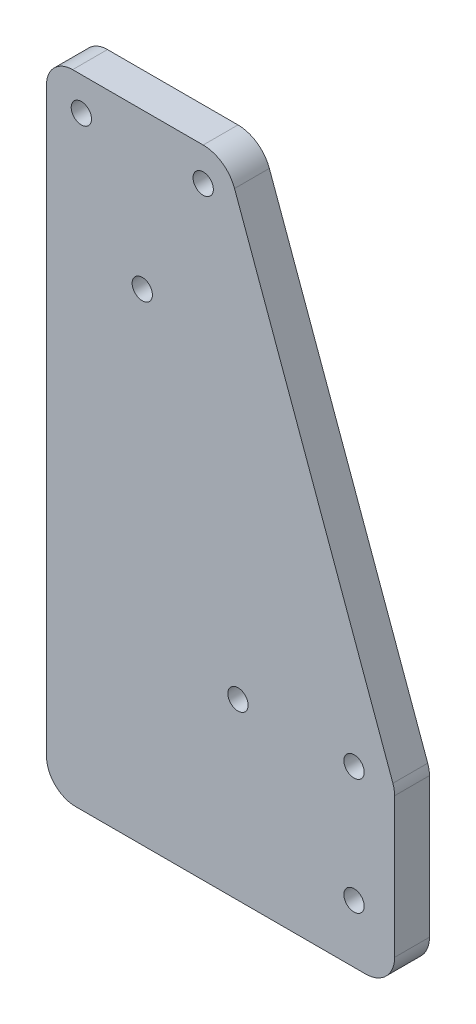
ISO-10303-21;
HEADER;
FILE_DESCRIPTION(('STEP AP214'),'2;1');
FILE_NAME('part.step','',(''),(''),'','','');
FILE_SCHEMA(('AUTOMOTIVE_DESIGN { 1 0 10303 214 1 1 1 1 }'));
ENDSEC;
DATA;
#1=APPLICATION_CONTEXT('core data for automotive mechanical design processes');
#2=APPLICATION_PROTOCOL_DEFINITION('international standard','automotive_design',2000,#1);
#3=PRODUCT_CONTEXT('',#1,'mechanical');
#4=PRODUCT('Part','Part','',(#3));
#5=PRODUCT_RELATED_PRODUCT_CATEGORY('part','',(#4));
#6=PRODUCT_DEFINITION_FORMATION('','',#4);
#7=PRODUCT_DEFINITION_CONTEXT('part definition',#1,'design');
#8=PRODUCT_DEFINITION('design','',#6,#7);
#9=PRODUCT_DEFINITION_SHAPE('','',#8);
#10=(LENGTH_UNIT() NAMED_UNIT(*) SI_UNIT(.MILLI.,.METRE.));
#11=(NAMED_UNIT(*) PLANE_ANGLE_UNIT() SI_UNIT($,.RADIAN.));
#12=(NAMED_UNIT(*) SI_UNIT($,.STERADIAN.) SOLID_ANGLE_UNIT());
#13=UNCERTAINTY_MEASURE_WITH_UNIT(LENGTH_MEASURE(1.E-05),#10,'distance_accuracy_value','');
#14=(GEOMETRIC_REPRESENTATION_CONTEXT(3) GLOBAL_UNCERTAINTY_ASSIGNED_CONTEXT((#13)) GLOBAL_UNIT_ASSIGNED_CONTEXT((#10,
#11,#12)) REPRESENTATION_CONTEXT('',''));
#15=CARTESIAN_POINT('',(0.,0.,0.));
#16=DIRECTION('',(0.,0.,1.));
#17=DIRECTION('',(1.,0.,0.));
#18=AXIS2_PLACEMENT_3D('',#15,#16,#17);
#19=CARTESIAN_POINT('',(-30.,-55.,6.));
#20=DIRECTION('',(1.,0.,0.));
#21=DIRECTION('',(0.,0.,-1.));
#22=AXIS2_PLACEMENT_3D('',#19,#20,#21);
#23=PLANE('',#22);
#24=DIRECTION('',(0.,-1.,0.));
#25=VECTOR('',#24,1.);
#26=CARTESIAN_POINT('',(-30.,-55.,0.));
#27=LINE('',#26,#25);
#28=CARTESIAN_POINT('',(-30.,50.25,0.));
#29=VERTEX_POINT('',#28);
#30=CARTESIAN_POINT('',(-30.,-50.,0.));
#31=VERTEX_POINT('',#30);
#32=EDGE_CURVE('E200',#29,#31,#27,.T.);
#33=ORIENTED_EDGE('',*,*,#32,.T.);
#34=DIRECTION('',(0.,0.,-1.));
#35=VECTOR('',#34,1.);
#36=CARTESIAN_POINT('',(-30.,-50.,6.));
#37=LINE('',#36,#35);
#38=CARTESIAN_POINT('',(-30.,-50.,6.));
#39=VERTEX_POINT('',#38);
#40=EDGE_CURVE('E11',#31,#39,#37,.F.);
#41=ORIENTED_EDGE('',*,*,#40,.T.);
#42=DIRECTION('',(0.,-1.,0.));
#43=VECTOR('',#42,1.);
#44=CARTESIAN_POINT('',(-30.,-55.,6.));
#45=LINE('',#44,#43);
#46=CARTESIAN_POINT('',(-30.,50.25,6.));
#47=VERTEX_POINT('',#46);
#48=EDGE_CURVE('E192',#47,#39,#45,.T.);
#49=ORIENTED_EDGE('',*,*,#48,.F.);
#50=DIRECTION('',(0.,0.,-1.));
#51=VECTOR('',#50,1.);
#52=CARTESIAN_POINT('',(-30.,50.25,6.));
#53=LINE('',#52,#51);
#54=EDGE_CURVE('E150',#47,#29,#53,.T.);
#55=ORIENTED_EDGE('',*,*,#54,.T.);
#56=EDGE_LOOP('',(#33,#41,#49,#55));
#57=FACE_BOUND('',#56,.T.);
#58=ADVANCED_FACE('F33',(#57),#23,.F.);
#59=CARTESIAN_POINT('',(0.,0.,6.));
#60=DIRECTION('',(0.,0.,-1.));
#61=DIRECTION('',(-1.,0.,0.));
#62=AXIS2_PLACEMENT_3D('',#59,#60,#61);
#63=PLANE('',#62);
#64=DIRECTION('',(0.,1.,0.));
#65=VECTOR('',#64,1.);
#66=CARTESIAN_POINT('',(30.,-55.,6.));
#67=LINE('',#66,#65);
#68=CARTESIAN_POINT('',(30.,-50.,6.));
#69=VERTEX_POINT('',#68);
#70=CARTESIAN_POINT('',(30.,-25.8800519672053,6.));
#71=VERTEX_POINT('',#70);
#72=EDGE_CURVE('E190',#69,#71,#67,.T.);
#73=ORIENTED_EDGE('',*,*,#72,.T.);
#74=CARTESIAN_POINT('',(25.,-25.8800519672053,6.));
#75=DIRECTION('',(0.,0.,-1.));
#76=DIRECTION('',(-1.,0.,0.));
#77=AXIS2_PLACEMENT_3D('',#74,#75,#76);
#78=CIRCLE('',#77,5.);
#79=CARTESIAN_POINT('',(29.6995124167496,-24.1728369705467,6.));
#80=VERTEX_POINT('',#79);
#81=EDGE_CURVE('E220',#71,#80,#78,.F.);
#82=ORIENTED_EDGE('',*,*,#81,.T.);
#83=DIRECTION('',(-0.341442999331723,0.939902483349925,0.));
#84=VECTOR('',#83,1.);
#85=CARTESIAN_POINT('',(30.,-25.,6.));
#86=LINE('',#85,#84);
#87=CARTESIAN_POINT('',(2.40443927926208,50.9632972461574,6.));
#88=VERTEX_POINT('',#87);
#89=EDGE_CURVE('E122',#80,#88,#86,.T.);
#90=ORIENTED_EDGE('',*,*,#89,.T.);
#91=CARTESIAN_POINT('',(-3.,49.,6.));
#92=DIRECTION('',(0.,0.,1.));
#93=DIRECTION('',(-1.,0.,0.));
#94=AXIS2_PLACEMENT_3D('',#91,#92,#93);
#95=CIRCLE('',#94,5.75000000000001);
#96=CARTESIAN_POINT('',(-3.,54.75,6.));
#97=VERTEX_POINT('',#96);
#98=EDGE_CURVE('E115',#88,#97,#95,.T.);
#99=ORIENTED_EDGE('',*,*,#98,.T.);
#100=DIRECTION('',(-1.,0.,0.));
#101=VECTOR('',#100,1.);
#102=CARTESIAN_POINT('',(-3.,54.75,6.));
#103=LINE('',#102,#101);
#104=CARTESIAN_POINT('',(-25.5,54.75,6.));
#105=VERTEX_POINT('',#104);
#106=EDGE_CURVE('E125',#97,#105,#103,.T.);
#107=ORIENTED_EDGE('',*,*,#106,.T.);
#108=CARTESIAN_POINT('',(-25.5,50.25,6.));
#109=DIRECTION('',(0.,0.,1.));
#110=DIRECTION('',(-1.,0.,0.));
#111=AXIS2_PLACEMENT_3D('',#108,#109,#110);
#112=CIRCLE('',#111,4.5);
#113=EDGE_CURVE('E129',#105,#47,#112,.T.);
#114=ORIENTED_EDGE('',*,*,#113,.T.);
#115=ORIENTED_EDGE('',*,*,#48,.T.);
#116=CARTESIAN_POINT('',(-25.,-50.,6.));
#117=DIRECTION('',(0.,0.,-1.));
#118=DIRECTION('',(-1.,0.,0.));
#119=AXIS2_PLACEMENT_3D('',#116,#117,#118);
#120=CIRCLE('',#119,5.);
#121=CARTESIAN_POINT('',(-25.,-55.,6.));
#122=VERTEX_POINT('',#121);
#123=EDGE_CURVE('E54',#39,#122,#120,.F.);
#124=ORIENTED_EDGE('',*,*,#123,.T.);
#125=DIRECTION('',(1.,0.,0.));
#126=VECTOR('',#125,1.);
#127=CARTESIAN_POINT('',(-30.,-55.,6.));
#128=LINE('',#127,#126);
#129=CARTESIAN_POINT('',(25.,-55.,6.));
#130=VERTEX_POINT('',#129);
#131=EDGE_CURVE('E195',#122,#130,#128,.T.);
#132=ORIENTED_EDGE('',*,*,#131,.T.);
#133=CARTESIAN_POINT('',(25.,-50.,6.));
#134=DIRECTION('',(0.,0.,-1.));
#135=DIRECTION('',(-1.,0.,0.));
#136=AXIS2_PLACEMENT_3D('',#133,#134,#135);
#137=CIRCLE('',#136,5.);
#138=EDGE_CURVE('E218',#130,#69,#137,.F.);
#139=ORIENTED_EDGE('',*,*,#138,.T.);
#140=EDGE_LOOP('',(#73,#82,#90,#99,#107,#114,#115,#124,#132,#139));
#141=FACE_BOUND('',#140,.T.);
#142=CARTESIAN_POINT('',(-24.,49.,6.));
#143=DIRECTION('',(0.,0.,1.));
#144=DIRECTION('',(1.,0.,0.));
#145=AXIS2_PLACEMENT_3D('',#142,#143,#144);
#146=CIRCLE('',#145,1.75);
#147=CARTESIAN_POINT('',(-22.25,49.,6.));
#148=VERTEX_POINT('',#147);
#149=EDGE_CURVE('E158',#148,#148,#146,.T.);
#150=ORIENTED_EDGE('',*,*,#149,.F.);
#151=EDGE_LOOP('',(#150));
#152=FACE_BOUND('',#151,.T.);
#153=CARTESIAN_POINT('',(-3.,49.,6.));
#154=DIRECTION('',(0.,0.,1.));
#155=DIRECTION('',(-1.,0.,0.));
#156=AXIS2_PLACEMENT_3D('',#153,#154,#155);
#157=CIRCLE('',#156,1.75);
#158=CARTESIAN_POINT('',(-4.75,49.,6.));
#159=VERTEX_POINT('',#158);
#160=EDGE_CURVE('E164',#159,#159,#157,.T.);
#161=ORIENTED_EDGE('',*,*,#160,.F.);
#162=EDGE_LOOP('',(#161));
#163=FACE_BOUND('',#162,.T.);
#164=CARTESIAN_POINT('',(-13.5,28.,6.));
#165=DIRECTION('',(0.,0.,1.));
#166=DIRECTION('',(1.,0.,0.));
#167=AXIS2_PLACEMENT_3D('',#164,#165,#166);
#168=CIRCLE('',#167,1.75);
#169=CARTESIAN_POINT('',(-11.75,28.,6.));
#170=VERTEX_POINT('',#169);
#171=EDGE_CURVE('E149',#170,#170,#168,.T.);
#172=ORIENTED_EDGE('',*,*,#171,.F.);
#173=EDGE_LOOP('',(#172));
#174=FACE_BOUND('',#173,.T.);
#175=CARTESIAN_POINT('',(3.,-25.,6.));
#176=DIRECTION('',(0.,0.,1.));
#177=DIRECTION('',(1.,0.,0.));
#178=AXIS2_PLACEMENT_3D('',#175,#176,#177);
#179=CIRCLE('',#178,1.75);
#180=CARTESIAN_POINT('',(4.75000000000001,-25.,6.));
#181=VERTEX_POINT('',#180);
#182=EDGE_CURVE('E184',#181,#181,#179,.T.);
#183=ORIENTED_EDGE('',*,*,#182,.F.);
#184=EDGE_LOOP('',(#183));
#185=FACE_BOUND('',#184,.T.);
#186=CARTESIAN_POINT('',(23.,-45.,6.));
#187=DIRECTION('',(0.,0.,1.));
#188=DIRECTION('',(1.,0.,0.));
#189=AXIS2_PLACEMENT_3D('',#186,#187,#188);
#190=CIRCLE('',#189,1.75);
#191=CARTESIAN_POINT('',(24.75,-45.,6.));
#192=VERTEX_POINT('',#191);
#193=EDGE_CURVE('E178',#192,#192,#190,.T.);
#194=ORIENTED_EDGE('',*,*,#193,.F.);
#195=EDGE_LOOP('',(#194));
#196=FACE_BOUND('',#195,.T.);
#197=CARTESIAN_POINT('',(23.,-25.,6.));
#198=DIRECTION('',(0.,0.,1.));
#199=DIRECTION('',(1.,0.,0.));
#200=AXIS2_PLACEMENT_3D('',#197,#198,#199);
#201=CIRCLE('',#200,1.75);
#202=CARTESIAN_POINT('',(24.75,-25.,6.));
#203=VERTEX_POINT('',#202);
#204=EDGE_CURVE('E172',#203,#203,#201,.T.);
#205=ORIENTED_EDGE('',*,*,#204,.F.);
#206=EDGE_LOOP('',(#205));
#207=FACE_BOUND('',#206,.T.);
#208=ADVANCED_FACE('F132',(#141,#152,#163,#174,#185,#196,#207),#63,.F.);
#209=CARTESIAN_POINT('',(0.,0.,0.));
#210=DIRECTION('',(0.,0.,-1.));
#211=DIRECTION('',(-1.,0.,0.));
#212=AXIS2_PLACEMENT_3D('',#209,#210,#211);
#213=PLANE('',#212);
#214=DIRECTION('',(-0.341442999331723,0.939902483349925,0.));
#215=VECTOR('',#214,1.);
#216=CARTESIAN_POINT('',(30.,-25.,0.));
#217=LINE('',#216,#215);
#218=CARTESIAN_POINT('',(29.6995124167496,-24.1728369705467,0.));
#219=VERTEX_POINT('',#218);
#220=CARTESIAN_POINT('',(2.40443927926208,50.9632972461574,0.));
#221=VERTEX_POINT('',#220);
#222=EDGE_CURVE('E136',#219,#221,#217,.T.);
#223=ORIENTED_EDGE('',*,*,#222,.F.);
#224=CARTESIAN_POINT('',(25.,-25.8800519672053,0.));
#225=DIRECTION('',(0.,0.,-1.));
#226=DIRECTION('',(-1.,0.,0.));
#227=AXIS2_PLACEMENT_3D('',#224,#225,#226);
#228=CIRCLE('',#227,5.);
#229=CARTESIAN_POINT('',(30.,-25.8800519672053,0.));
#230=VERTEX_POINT('',#229);
#231=EDGE_CURVE('E210',#219,#230,#228,.T.);
#232=ORIENTED_EDGE('',*,*,#231,.T.);
#233=DIRECTION('',(0.,1.,0.));
#234=VECTOR('',#233,1.);
#235=CARTESIAN_POINT('',(30.,-55.,0.));
#236=LINE('',#235,#234);
#237=CARTESIAN_POINT('',(30.,-50.,0.));
#238=VERTEX_POINT('',#237);
#239=EDGE_CURVE('E187',#238,#230,#236,.T.);
#240=ORIENTED_EDGE('',*,*,#239,.F.);
#241=CARTESIAN_POINT('',(25.,-50.,0.));
#242=DIRECTION('',(0.,0.,-1.));
#243=DIRECTION('',(-1.,0.,0.));
#244=AXIS2_PLACEMENT_3D('',#241,#242,#243);
#245=CIRCLE('',#244,5.);
#246=CARTESIAN_POINT('',(25.,-55.,0.));
#247=VERTEX_POINT('',#246);
#248=EDGE_CURVE('E208',#238,#247,#245,.T.);
#249=ORIENTED_EDGE('',*,*,#248,.T.);
#250=DIRECTION('',(1.,0.,0.));
#251=VECTOR('',#250,1.);
#252=CARTESIAN_POINT('',(-30.,-55.,0.));
#253=LINE('',#252,#251);
#254=CARTESIAN_POINT('',(-25.,-55.,0.));
#255=VERTEX_POINT('',#254);
#256=EDGE_CURVE('E193',#255,#247,#253,.T.);
#257=ORIENTED_EDGE('',*,*,#256,.F.);
#258=CARTESIAN_POINT('',(-25.,-50.,0.));
#259=DIRECTION('',(0.,0.,-1.));
#260=DIRECTION('',(-1.,0.,0.));
#261=AXIS2_PLACEMENT_3D('',#258,#259,#260);
#262=CIRCLE('',#261,5.);
#263=EDGE_CURVE('E206',#255,#31,#262,.T.);
#264=ORIENTED_EDGE('',*,*,#263,.T.);
#265=ORIENTED_EDGE('',*,*,#32,.F.);
#266=CARTESIAN_POINT('',(-25.5,50.25,0.));
#267=DIRECTION('',(0.,0.,1.));
#268=DIRECTION('',(-1.,0.,0.));
#269=AXIS2_PLACEMENT_3D('',#266,#267,#268);
#270=CIRCLE('',#269,4.5);
#271=CARTESIAN_POINT('',(-25.5,54.75,0.));
#272=VERTEX_POINT('',#271);
#273=EDGE_CURVE('E138',#272,#29,#270,.T.);
#274=ORIENTED_EDGE('',*,*,#273,.F.);
#275=DIRECTION('',(-1.,0.,0.));
#276=VECTOR('',#275,1.);
#277=CARTESIAN_POINT('',(-3.,54.75,0.));
#278=LINE('',#277,#276);
#279=CARTESIAN_POINT('',(-3.,54.75,0.));
#280=VERTEX_POINT('',#279);
#281=EDGE_CURVE('E144',#280,#272,#278,.T.);
#282=ORIENTED_EDGE('',*,*,#281,.F.);
#283=CARTESIAN_POINT('',(-3.,49.,0.));
#284=DIRECTION('',(0.,0.,1.));
#285=DIRECTION('',(-1.,0.,0.));
#286=AXIS2_PLACEMENT_3D('',#283,#284,#285);
#287=CIRCLE('',#286,5.75000000000001);
#288=EDGE_CURVE('E117',#221,#280,#287,.T.);
#289=ORIENTED_EDGE('',*,*,#288,.F.);
#290=EDGE_LOOP('',(#223,#232,#240,#249,#257,#264,#265,#274,#282,#289));
#291=FACE_BOUND('',#290,.T.);
#292=CARTESIAN_POINT('',(-24.,49.,0.));
#293=DIRECTION('',(0.,0.,1.));
#294=DIRECTION('',(1.,0.,0.));
#295=AXIS2_PLACEMENT_3D('',#292,#293,#294);
#296=CIRCLE('',#295,1.75);
#297=CARTESIAN_POINT('',(-22.25,49.,0.));
#298=VERTEX_POINT('',#297);
#299=EDGE_CURVE('E154',#298,#298,#296,.T.);
#300=ORIENTED_EDGE('',*,*,#299,.T.);
#301=EDGE_LOOP('',(#300));
#302=FACE_BOUND('',#301,.T.);
#303=CARTESIAN_POINT('',(-3.,49.,0.));
#304=DIRECTION('',(0.,0.,1.));
#305=DIRECTION('',(-1.,0.,0.));
#306=AXIS2_PLACEMENT_3D('',#303,#304,#305);
#307=CIRCLE('',#306,1.75);
#308=CARTESIAN_POINT('',(-4.75,49.,0.));
#309=VERTEX_POINT('',#308);
#310=EDGE_CURVE('E161',#309,#309,#307,.T.);
#311=ORIENTED_EDGE('',*,*,#310,.T.);
#312=EDGE_LOOP('',(#311));
#313=FACE_BOUND('',#312,.T.);
#314=CARTESIAN_POINT('',(-13.5,28.,0.));
#315=DIRECTION('',(0.,0.,1.));
#316=DIRECTION('',(1.,0.,0.));
#317=AXIS2_PLACEMENT_3D('',#314,#315,#316);
#318=CIRCLE('',#317,1.75);
#319=CARTESIAN_POINT('',(-11.75,28.,0.));
#320=VERTEX_POINT('',#319);
#321=EDGE_CURVE('E167',#320,#320,#318,.T.);
#322=ORIENTED_EDGE('',*,*,#321,.T.);
#323=EDGE_LOOP('',(#322));
#324=FACE_BOUND('',#323,.T.);
#325=CARTESIAN_POINT('',(23.,-45.,0.));
#326=DIRECTION('',(0.,0.,1.));
#327=DIRECTION('',(1.,0.,0.));
#328=AXIS2_PLACEMENT_3D('',#325,#326,#327);
#329=CIRCLE('',#328,1.75);
#330=CARTESIAN_POINT('',(24.75,-45.,0.));
#331=VERTEX_POINT('',#330);
#332=EDGE_CURVE('E175',#331,#331,#329,.T.);
#333=ORIENTED_EDGE('',*,*,#332,.T.);
#334=EDGE_LOOP('',(#333));
#335=FACE_BOUND('',#334,.T.);
#336=CARTESIAN_POINT('',(3.,-25.,0.));
#337=DIRECTION('',(0.,0.,1.));
#338=DIRECTION('',(1.,0.,0.));
#339=AXIS2_PLACEMENT_3D('',#336,#337,#338);
#340=CIRCLE('',#339,1.75);
#341=CARTESIAN_POINT('',(4.75000000000001,-25.,0.));
#342=VERTEX_POINT('',#341);
#343=EDGE_CURVE('E181',#342,#342,#340,.T.);
#344=ORIENTED_EDGE('',*,*,#343,.T.);
#345=EDGE_LOOP('',(#344));
#346=FACE_BOUND('',#345,.T.);
#347=CARTESIAN_POINT('',(23.,-25.,0.));
#348=DIRECTION('',(0.,0.,1.));
#349=DIRECTION('',(1.,0.,0.));
#350=AXIS2_PLACEMENT_3D('',#347,#348,#349);
#351=CIRCLE('',#350,1.75);
#352=CARTESIAN_POINT('',(24.75,-25.,0.));
#353=VERTEX_POINT('',#352);
#354=EDGE_CURVE('E157',#353,#353,#351,.T.);
#355=ORIENTED_EDGE('',*,*,#354,.T.);
#356=EDGE_LOOP('',(#355));
#357=FACE_BOUND('',#356,.T.);
#358=ADVANCED_FACE('F230',(#291,#302,#313,#324,#335,#346,#357),#213,.T.);
#359=CARTESIAN_POINT('',(30.,-55.,6.));
#360=DIRECTION('',(-1.,0.,0.));
#361=DIRECTION('',(0.,-1.,0.));
#362=AXIS2_PLACEMENT_3D('',#359,#360,#361);
#363=PLANE('',#362);
#364=ORIENTED_EDGE('',*,*,#239,.T.);
#365=DIRECTION('',(0.,0.,-1.));
#366=VECTOR('',#365,1.);
#367=CARTESIAN_POINT('',(30.,-25.8800519672053,6.));
#368=LINE('',#367,#366);
#369=EDGE_CURVE('E215',#230,#71,#368,.F.);
#370=ORIENTED_EDGE('',*,*,#369,.T.);
#371=ORIENTED_EDGE('',*,*,#72,.F.);
#372=DIRECTION('',(0.,0.,-1.));
#373=VECTOR('',#372,1.);
#374=CARTESIAN_POINT('',(30.,-50.,6.));
#375=LINE('',#374,#373);
#376=EDGE_CURVE('E212',#69,#238,#375,.T.);
#377=ORIENTED_EDGE('',*,*,#376,.T.);
#378=EDGE_LOOP('',(#364,#370,#371,#377));
#379=FACE_BOUND('',#378,.T.);
#380=ADVANCED_FACE('F240',(#379),#363,.F.);
#381=CARTESIAN_POINT('',(-30.,-55.,6.));
#382=DIRECTION('',(0.,1.,0.));
#383=DIRECTION('',(0.,0.,1.));
#384=AXIS2_PLACEMENT_3D('',#381,#382,#383);
#385=PLANE('',#384);
#386=ORIENTED_EDGE('',*,*,#256,.T.);
#387=DIRECTION('',(0.,0.,-1.));
#388=VECTOR('',#387,1.);
#389=CARTESIAN_POINT('',(25.,-55.,6.));
#390=LINE('',#389,#388);
#391=EDGE_CURVE('E41',#247,#130,#390,.F.);
#392=ORIENTED_EDGE('',*,*,#391,.T.);
#393=ORIENTED_EDGE('',*,*,#131,.F.);
#394=DIRECTION('',(0.,0.,-1.));
#395=VECTOR('',#394,1.);
#396=CARTESIAN_POINT('',(-25.,-55.,6.));
#397=LINE('',#396,#395);
#398=EDGE_CURVE('E222',#122,#255,#397,.T.);
#399=ORIENTED_EDGE('',*,*,#398,.T.);
#400=EDGE_LOOP('',(#386,#392,#393,#399));
#401=FACE_BOUND('',#400,.T.);
#402=ADVANCED_FACE('F226',(#401),#385,.F.);
#403=CARTESIAN_POINT('',(3.,-25.,6.));
#404=DIRECTION('',(0.,0.,-1.));
#405=DIRECTION('',(-1.,0.,0.));
#406=AXIS2_PLACEMENT_3D('',#403,#404,#405);
#407=CYLINDRICAL_SURFACE('',#406,1.75);
#408=ORIENTED_EDGE('',*,*,#182,.T.);
#409=EDGE_LOOP('',(#408));
#410=FACE_BOUND('',#409,.T.);
#411=ORIENTED_EDGE('',*,*,#343,.F.);
#412=EDGE_LOOP('',(#411));
#413=FACE_BOUND('',#412,.T.);
#414=ADVANCED_FACE('F301',(#410,#413),#407,.F.);
#415=CARTESIAN_POINT('',(23.,-45.,6.));
#416=DIRECTION('',(0.,0.,-1.));
#417=DIRECTION('',(-1.,0.,0.));
#418=AXIS2_PLACEMENT_3D('',#415,#416,#417);
#419=CYLINDRICAL_SURFACE('',#418,1.75);
#420=ORIENTED_EDGE('',*,*,#193,.T.);
#421=EDGE_LOOP('',(#420));
#422=FACE_BOUND('',#421,.T.);
#423=ORIENTED_EDGE('',*,*,#332,.F.);
#424=EDGE_LOOP('',(#423));
#425=FACE_BOUND('',#424,.T.);
#426=ADVANCED_FACE('F297',(#422,#425),#419,.F.);
#427=CARTESIAN_POINT('',(23.,-25.,6.));
#428=DIRECTION('',(0.,0.,-1.));
#429=DIRECTION('',(-1.,0.,0.));
#430=AXIS2_PLACEMENT_3D('',#427,#428,#429);
#431=CYLINDRICAL_SURFACE('',#430,1.75);
#432=ORIENTED_EDGE('',*,*,#204,.T.);
#433=EDGE_LOOP('',(#432));
#434=FACE_BOUND('',#433,.T.);
#435=ORIENTED_EDGE('',*,*,#354,.F.);
#436=EDGE_LOOP('',(#435));
#437=FACE_BOUND('',#436,.T.);
#438=ADVANCED_FACE('F293',(#434,#437),#431,.F.);
#439=CARTESIAN_POINT('',(-13.5,28.,0.));
#440=DIRECTION('',(0.,0.,1.));
#441=DIRECTION('',(1.,0.,0.));
#442=AXIS2_PLACEMENT_3D('',#439,#440,#441);
#443=CYLINDRICAL_SURFACE('',#442,1.75);
#444=ORIENTED_EDGE('',*,*,#321,.F.);
#445=EDGE_LOOP('',(#444));
#446=FACE_BOUND('',#445,.T.);
#447=ORIENTED_EDGE('',*,*,#171,.T.);
#448=EDGE_LOOP('',(#447));
#449=FACE_BOUND('',#448,.T.);
#450=ADVANCED_FACE('F289',(#446,#449),#443,.F.);
#451=CARTESIAN_POINT('',(-3.,49.,0.));
#452=DIRECTION('',(0.,0.,1.));
#453=DIRECTION('',(1.,0.,0.));
#454=AXIS2_PLACEMENT_3D('',#451,#452,#453);
#455=CYLINDRICAL_SURFACE('',#454,1.75);
#456=ORIENTED_EDGE('',*,*,#310,.F.);
#457=EDGE_LOOP('',(#456));
#458=FACE_BOUND('',#457,.T.);
#459=ORIENTED_EDGE('',*,*,#160,.T.);
#460=EDGE_LOOP('',(#459));
#461=FACE_BOUND('',#460,.T.);
#462=ADVANCED_FACE('F285',(#458,#461),#455,.F.);
#463=CARTESIAN_POINT('',(-24.,49.,0.));
#464=DIRECTION('',(0.,0.,1.));
#465=DIRECTION('',(1.,0.,0.));
#466=AXIS2_PLACEMENT_3D('',#463,#464,#465);
#467=CYLINDRICAL_SURFACE('',#466,1.75);
#468=ORIENTED_EDGE('',*,*,#299,.F.);
#469=EDGE_LOOP('',(#468));
#470=FACE_BOUND('',#469,.T.);
#471=ORIENTED_EDGE('',*,*,#149,.T.);
#472=EDGE_LOOP('',(#471));
#473=FACE_BOUND('',#472,.T.);
#474=ADVANCED_FACE('F282',(#470,#473),#467,.F.);
#475=CARTESIAN_POINT('',(-3.,49.,6.));
#476=DIRECTION('',(0.,0.,-1.));
#477=DIRECTION('',(-1.,0.,0.));
#478=AXIS2_PLACEMENT_3D('',#475,#476,#477);
#479=CYLINDRICAL_SURFACE('',#478,5.75000000000001);
#480=ORIENTED_EDGE('',*,*,#288,.T.);
#481=DIRECTION('',(0.,0.,-1.));
#482=VECTOR('',#481,1.);
#483=CARTESIAN_POINT('',(-3.,54.75,6.));
#484=LINE('',#483,#482);
#485=EDGE_CURVE('E110',#97,#280,#484,.T.);
#486=ORIENTED_EDGE('',*,*,#485,.F.);
#487=ORIENTED_EDGE('',*,*,#98,.F.);
#488=DIRECTION('',(0.,0.,-1.));
#489=VECTOR('',#488,1.);
#490=CARTESIAN_POINT('',(2.40443927926208,50.9632972461574,6.));
#491=LINE('',#490,#489);
#492=EDGE_CURVE('E147',#88,#221,#491,.T.);
#493=ORIENTED_EDGE('',*,*,#492,.T.);
#494=EDGE_LOOP('',(#480,#486,#487,#493));
#495=FACE_BOUND('',#494,.T.);
#496=ADVANCED_FACE('F112',(#495),#479,.T.);
#497=CARTESIAN_POINT('',(30.,-25.,6.));
#498=DIRECTION('',(-0.939902483349925,-0.341442999331723,0.));
#499=DIRECTION('',(0.341442999331723,-0.939902483349925,0.));
#500=AXIS2_PLACEMENT_3D('',#497,#498,#499);
#501=PLANE('',#500);
#502=ORIENTED_EDGE('',*,*,#89,.F.);
#503=DIRECTION('',(0.,0.,-1.));
#504=VECTOR('',#503,1.);
#505=CARTESIAN_POINT('',(29.6995124167496,-24.1728369705467,6.));
#506=LINE('',#505,#504);
#507=EDGE_CURVE('E197',#80,#219,#506,.T.);
#508=ORIENTED_EDGE('',*,*,#507,.T.);
#509=ORIENTED_EDGE('',*,*,#222,.T.);
#510=ORIENTED_EDGE('',*,*,#492,.F.);
#511=EDGE_LOOP('',(#502,#508,#509,#510));
#512=FACE_BOUND('',#511,.T.);
#513=ADVANCED_FACE('F247',(#512),#501,.F.);
#514=CARTESIAN_POINT('',(-25.5,50.25,6.));
#515=DIRECTION('',(0.,0.,-1.));
#516=DIRECTION('',(-1.,0.,0.));
#517=AXIS2_PLACEMENT_3D('',#514,#515,#516);
#518=CYLINDRICAL_SURFACE('',#517,4.5);
#519=ORIENTED_EDGE('',*,*,#273,.T.);
#520=ORIENTED_EDGE('',*,*,#54,.F.);
#521=ORIENTED_EDGE('',*,*,#113,.F.);
#522=DIRECTION('',(0.,0.,-1.));
#523=VECTOR('',#522,1.);
#524=CARTESIAN_POINT('',(-25.5,54.75,6.));
#525=LINE('',#524,#523);
#526=EDGE_CURVE('E121',#105,#272,#525,.T.);
#527=ORIENTED_EDGE('',*,*,#526,.T.);
#528=EDGE_LOOP('',(#519,#520,#521,#527));
#529=FACE_BOUND('',#528,.T.);
#530=ADVANCED_FACE('F250',(#529),#518,.T.);
#531=CARTESIAN_POINT('',(-3.,54.75,6.));
#532=DIRECTION('',(0.,-1.,0.));
#533=DIRECTION('',(1.,0.,0.));
#534=AXIS2_PLACEMENT_3D('',#531,#532,#533);
#535=PLANE('',#534);
#536=ORIENTED_EDGE('',*,*,#281,.T.);
#537=ORIENTED_EDGE('',*,*,#526,.F.);
#538=ORIENTED_EDGE('',*,*,#106,.F.);
#539=ORIENTED_EDGE('',*,*,#485,.T.);
#540=EDGE_LOOP('',(#536,#537,#538,#539));
#541=FACE_BOUND('',#540,.T.);
#542=ADVANCED_FACE('F126',(#541),#535,.F.);
#543=CARTESIAN_POINT('',(25.,-25.8800519672053,6.));
#544=DIRECTION('',(0.,0.,-1.));
#545=DIRECTION('',(-1.,0.,0.));
#546=AXIS2_PLACEMENT_3D('',#543,#544,#545);
#547=CYLINDRICAL_SURFACE('',#546,5.);
#548=ORIENTED_EDGE('',*,*,#81,.F.);
#549=ORIENTED_EDGE('',*,*,#369,.F.);
#550=ORIENTED_EDGE('',*,*,#231,.F.);
#551=ORIENTED_EDGE('',*,*,#507,.F.);
#552=EDGE_LOOP('',(#548,#549,#550,#551));
#553=FACE_BOUND('',#552,.T.);
#554=ADVANCED_FACE('F245',(#553),#547,.T.);
#555=CARTESIAN_POINT('',(25.,-50.,6.));
#556=DIRECTION('',(0.,0.,-1.));
#557=DIRECTION('',(-1.,0.,0.));
#558=AXIS2_PLACEMENT_3D('',#555,#556,#557);
#559=CYLINDRICAL_SURFACE('',#558,5.);
#560=ORIENTED_EDGE('',*,*,#138,.F.);
#561=ORIENTED_EDGE('',*,*,#391,.F.);
#562=ORIENTED_EDGE('',*,*,#248,.F.);
#563=ORIENTED_EDGE('',*,*,#376,.F.);
#564=EDGE_LOOP('',(#560,#561,#562,#563));
#565=FACE_BOUND('',#564,.T.);
#566=ADVANCED_FACE('F237',(#565),#559,.T.);
#567=CARTESIAN_POINT('',(-25.,-50.,6.));
#568=DIRECTION('',(0.,0.,-1.));
#569=DIRECTION('',(-1.,0.,0.));
#570=AXIS2_PLACEMENT_3D('',#567,#568,#569);
#571=CYLINDRICAL_SURFACE('',#570,5.);
#572=ORIENTED_EDGE('',*,*,#123,.F.);
#573=ORIENTED_EDGE('',*,*,#40,.F.);
#574=ORIENTED_EDGE('',*,*,#263,.F.);
#575=ORIENTED_EDGE('',*,*,#398,.F.);
#576=EDGE_LOOP('',(#572,#573,#574,#575));
#577=FACE_BOUND('',#576,.T.);
#578=ADVANCED_FACE('F35',(#577),#571,.T.);
#579=CLOSED_SHELL('',(#58,#208,#358,#380,#402,#414,#426,#438,#450,#462,#474,#496,#513,#530,#542,
#554,#566,#578));
#580=MANIFOLD_SOLID_BREP('B2',#579);
#581=ADVANCED_BREP_SHAPE_REPRESENTATION('',(#18,#580),#14);
#582=SHAPE_DEFINITION_REPRESENTATION(#9,#581);
ENDSEC;
END-ISO-10303-21;
